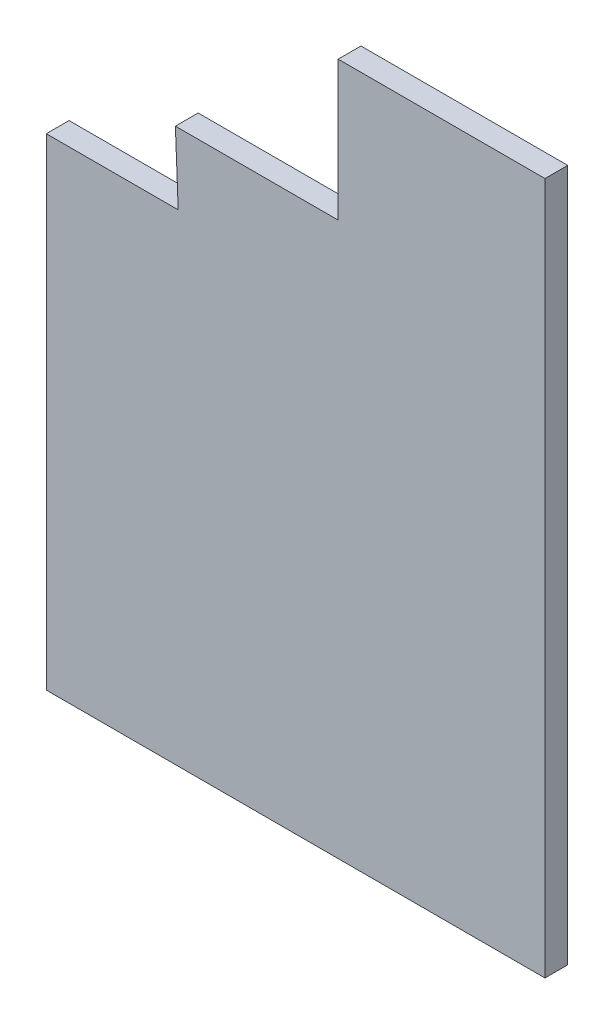
ISO-10303-21;
HEADER;
FILE_DESCRIPTION(('STEP AP214'),'2;1');
FILE_NAME('part.step','',(''),(''),'','','');
FILE_SCHEMA(('AUTOMOTIVE_DESIGN { 1 0 10303 214 1 1 1 1 }'));
ENDSEC;
DATA;
#1=APPLICATION_CONTEXT('core data for automotive mechanical design processes');
#2=APPLICATION_PROTOCOL_DEFINITION('international standard','automotive_design',2000,#1);
#3=PRODUCT_CONTEXT('',#1,'mechanical');
#4=PRODUCT('Part','Part','',(#3));
#5=PRODUCT_RELATED_PRODUCT_CATEGORY('part','',(#4));
#6=PRODUCT_DEFINITION_FORMATION('','',#4);
#7=PRODUCT_DEFINITION_CONTEXT('part definition',#1,'design');
#8=PRODUCT_DEFINITION('design','',#6,#7);
#9=PRODUCT_DEFINITION_SHAPE('','',#8);
#10=(LENGTH_UNIT() NAMED_UNIT(*) SI_UNIT(.MILLI.,.METRE.));
#11=(NAMED_UNIT(*) PLANE_ANGLE_UNIT() SI_UNIT($,.RADIAN.));
#12=(NAMED_UNIT(*) SI_UNIT($,.STERADIAN.) SOLID_ANGLE_UNIT());
#13=UNCERTAINTY_MEASURE_WITH_UNIT(LENGTH_MEASURE(1.E-05),#10,'distance_accuracy_value','');
#14=(GEOMETRIC_REPRESENTATION_CONTEXT(3) GLOBAL_UNCERTAINTY_ASSIGNED_CONTEXT((#13)) GLOBAL_UNIT_ASSIGNED_CONTEXT((#10,
#11,#12)) REPRESENTATION_CONTEXT('',''));
#15=CARTESIAN_POINT('',(0.,0.,0.));
#16=DIRECTION('',(0.,0.,1.));
#17=DIRECTION('',(1.,0.,0.));
#18=AXIS2_PLACEMENT_3D('',#15,#16,#17);
#19=CARTESIAN_POINT('',(11.712255719514,13.395011994689,0.5));
#20=DIRECTION('',(0.,0.,1.));
#21=DIRECTION('',(1.,0.,0.));
#22=AXIS2_PLACEMENT_3D('',#19,#20,#21);
#23=PLANE('',#22);
#24=DIRECTION('',(0.,1.,0.));
#25=VECTOR('',#24,1.);
#26=CARTESIAN_POINT('',(12.190204,18.392698,0.5));
#27=LINE('',#26,#25);
#28=CARTESIAN_POINT('',(12.190204,18.392698,0.5));
#29=VERTEX_POINT('',#28);
#30=CARTESIAN_POINT('',(12.190204,21.454895,0.5));
#31=VERTEX_POINT('',#30);
#32=EDGE_CURVE('E25',#29,#31,#27,.T.);
#33=ORIENTED_EDGE('',*,*,#32,.F.);
#34=DIRECTION('',(1.,0.,0.));
#35=VECTOR('',#34,1.);
#36=CARTESIAN_POINT('',(8.614215,18.392698,0.5));
#37=LINE('',#36,#35);
#38=CARTESIAN_POINT('',(8.614215,18.392698,0.5));
#39=VERTEX_POINT('',#38);
#40=EDGE_CURVE('E149',#39,#29,#37,.T.);
#41=ORIENTED_EDGE('',*,*,#40,.F.);
#42=DIRECTION('',(-0.0394430339495683,0.999221820754958,0.));
#43=VECTOR('',#42,1.);
#44=CARTESIAN_POINT('',(8.67587,16.830774,0.5));
#45=LINE('',#44,#43);
#46=CARTESIAN_POINT('',(8.67587,16.830774,0.5));
#47=VERTEX_POINT('',#46);
#48=EDGE_CURVE('E112',#47,#39,#45,.T.);
#49=ORIENTED_EDGE('',*,*,#48,.F.);
#50=DIRECTION('',(1.,0.,0.));
#51=VECTOR('',#50,1.);
#52=CARTESIAN_POINT('',(5.778087,16.830774,0.5));
#53=LINE('',#52,#51);
#54=CARTESIAN_POINT('',(5.778087,16.830774,0.5));
#55=VERTEX_POINT('',#54);
#56=EDGE_CURVE('E123',#55,#47,#53,.T.);
#57=ORIENTED_EDGE('',*,*,#56,.F.);
#58=DIRECTION('',(0.,1.,0.));
#59=VECTOR('',#58,1.);
#60=CARTESIAN_POINT('',(5.778087,6.246672,0.5));
#61=LINE('',#60,#59);
#62=CARTESIAN_POINT('',(5.778087,6.246672,0.5));
#63=VERTEX_POINT('',#62);
#64=EDGE_CURVE('E130',#63,#55,#61,.T.);
#65=ORIENTED_EDGE('',*,*,#64,.F.);
#66=DIRECTION('',(-1.,0.,0.));
#67=VECTOR('',#66,1.);
#68=CARTESIAN_POINT('',(16.732119,6.246672,0.5));
#69=LINE('',#68,#67);
#70=CARTESIAN_POINT('',(16.732119,6.246672,0.5));
#71=VERTEX_POINT('',#70);
#72=EDGE_CURVE('E194',#71,#63,#69,.T.);
#73=ORIENTED_EDGE('',*,*,#72,.F.);
#74=DIRECTION('',(0.,-1.,0.));
#75=VECTOR('',#74,1.);
#76=CARTESIAN_POINT('',(16.732119,21.454895,0.5));
#77=LINE('',#76,#75);
#78=CARTESIAN_POINT('',(16.732119,21.454895,0.5));
#79=VERTEX_POINT('',#78);
#80=EDGE_CURVE('E170',#79,#71,#77,.T.);
#81=ORIENTED_EDGE('',*,*,#80,.F.);
#82=DIRECTION('',(1.,0.,0.));
#83=VECTOR('',#82,1.);
#84=CARTESIAN_POINT('',(12.190204,21.454895,0.5));
#85=LINE('',#84,#83);
#86=EDGE_CURVE('E164',#31,#79,#85,.T.);
#87=ORIENTED_EDGE('',*,*,#86,.F.);
#88=EDGE_LOOP('',(#33,#41,#49,#57,#65,#73,#81,#87));
#89=FACE_BOUND('',#88,.T.);
#90=ADVANCED_FACE('F17',(#89),#23,.T.);
#91=CARTESIAN_POINT('',(11.712255719514,13.395011994689,0.));
#92=DIRECTION('',(0.,0.,1.));
#93=DIRECTION('',(1.,0.,0.));
#94=AXIS2_PLACEMENT_3D('',#91,#92,#93);
#95=PLANE('',#94);
#96=DIRECTION('',(1.,0.,0.));
#97=VECTOR('',#96,1.);
#98=CARTESIAN_POINT('',(12.190204,21.454895,0.));
#99=LINE('',#98,#97);
#100=CARTESIAN_POINT('',(12.190204,21.454895,0.));
#101=VERTEX_POINT('',#100);
#102=CARTESIAN_POINT('',(16.732119,21.454895,0.));
#103=VERTEX_POINT('',#102);
#104=EDGE_CURVE('E176',#101,#103,#99,.T.);
#105=ORIENTED_EDGE('',*,*,#104,.T.);
#106=DIRECTION('',(0.,-1.,0.));
#107=VECTOR('',#106,1.);
#108=CARTESIAN_POINT('',(16.732119,21.454895,0.));
#109=LINE('',#108,#107);
#110=CARTESIAN_POINT('',(16.732119,6.246672,0.));
#111=VERTEX_POINT('',#110);
#112=EDGE_CURVE('E195',#103,#111,#109,.T.);
#113=ORIENTED_EDGE('',*,*,#112,.T.);
#114=DIRECTION('',(-1.,0.,0.));
#115=VECTOR('',#114,1.);
#116=CARTESIAN_POINT('',(16.732119,6.246672,0.));
#117=LINE('',#116,#115);
#118=CARTESIAN_POINT('',(5.778087,6.246672,0.));
#119=VERTEX_POINT('',#118);
#120=EDGE_CURVE('E119',#111,#119,#117,.T.);
#121=ORIENTED_EDGE('',*,*,#120,.T.);
#122=DIRECTION('',(0.,1.,0.));
#123=VECTOR('',#122,1.);
#124=CARTESIAN_POINT('',(5.778087,6.246672,0.));
#125=LINE('',#124,#123);
#126=CARTESIAN_POINT('',(5.778087,16.830774,0.));
#127=VERTEX_POINT('',#126);
#128=EDGE_CURVE('E111',#119,#127,#125,.T.);
#129=ORIENTED_EDGE('',*,*,#128,.T.);
#130=DIRECTION('',(1.,0.,0.));
#131=VECTOR('',#130,1.);
#132=CARTESIAN_POINT('',(5.778087,16.830774,0.));
#133=LINE('',#132,#131);
#134=CARTESIAN_POINT('',(8.67587,16.830774,0.));
#135=VERTEX_POINT('',#134);
#136=EDGE_CURVE('E97',#127,#135,#133,.T.);
#137=ORIENTED_EDGE('',*,*,#136,.T.);
#138=DIRECTION('',(-0.0394430339495683,0.999221820754958,0.));
#139=VECTOR('',#138,1.);
#140=CARTESIAN_POINT('',(8.67587,16.830774,0.));
#141=LINE('',#140,#139);
#142=CARTESIAN_POINT('',(8.614215,18.392698,0.));
#143=VERTEX_POINT('',#142);
#144=EDGE_CURVE('E148',#135,#143,#141,.T.);
#145=ORIENTED_EDGE('',*,*,#144,.T.);
#146=DIRECTION('',(1.,0.,0.));
#147=VECTOR('',#146,1.);
#148=CARTESIAN_POINT('',(8.614215,18.392698,0.));
#149=LINE('',#148,#147);
#150=CARTESIAN_POINT('',(12.190204,18.392698,0.));
#151=VERTEX_POINT('',#150);
#152=EDGE_CURVE('E156',#143,#151,#149,.T.);
#153=ORIENTED_EDGE('',*,*,#152,.T.);
#154=DIRECTION('',(0.,1.,0.));
#155=VECTOR('',#154,1.);
#156=CARTESIAN_POINT('',(12.190204,18.392698,0.));
#157=LINE('',#156,#155);
#158=EDGE_CURVE('E11',#151,#101,#157,.T.);
#159=ORIENTED_EDGE('',*,*,#158,.T.);
#160=EDGE_LOOP('',(#105,#113,#121,#129,#137,#145,#153,#159));
#161=FACE_BOUND('',#160,.T.);
#162=ADVANCED_FACE('F116',(#161),#95,.F.);
#163=CARTESIAN_POINT('',(12.190204,18.392698,0.));
#164=DIRECTION('',(-1.,0.,0.));
#165=DIRECTION('',(0.,0.,1.));
#166=AXIS2_PLACEMENT_3D('',#163,#164,#165);
#167=PLANE('',#166);
#168=DIRECTION('',(0.,0.,1.));
#169=VECTOR('',#168,1.);
#170=CARTESIAN_POINT('',(12.190204,18.392698,0.));
#171=LINE('',#170,#169);
#172=EDGE_CURVE('E153',#151,#29,#171,.T.);
#173=ORIENTED_EDGE('',*,*,#172,.T.);
#174=ORIENTED_EDGE('',*,*,#32,.T.);
#175=DIRECTION('',(0.,0.,1.));
#176=VECTOR('',#175,1.);
#177=CARTESIAN_POINT('',(12.190204,21.454895,0.));
#178=LINE('',#177,#176);
#179=EDGE_CURVE('E165',#101,#31,#178,.T.);
#180=ORIENTED_EDGE('',*,*,#179,.F.);
#181=ORIENTED_EDGE('',*,*,#158,.F.);
#182=EDGE_LOOP('',(#173,#174,#180,#181));
#183=FACE_BOUND('',#182,.T.);
#184=ADVANCED_FACE('F159',(#183),#167,.T.);
#185=CARTESIAN_POINT('',(8.614215,18.392698,0.));
#186=DIRECTION('',(0.,1.,0.));
#187=DIRECTION('',(1.,0.,0.));
#188=AXIS2_PLACEMENT_3D('',#185,#186,#187);
#189=PLANE('',#188);
#190=DIRECTION('',(0.,0.,1.));
#191=VECTOR('',#190,1.);
#192=CARTESIAN_POINT('',(8.614215,18.392698,0.));
#193=LINE('',#192,#191);
#194=EDGE_CURVE('E142',#143,#39,#193,.T.);
#195=ORIENTED_EDGE('',*,*,#194,.T.);
#196=ORIENTED_EDGE('',*,*,#40,.T.);
#197=ORIENTED_EDGE('',*,*,#172,.F.);
#198=ORIENTED_EDGE('',*,*,#152,.F.);
#199=EDGE_LOOP('',(#195,#196,#197,#198));
#200=FACE_BOUND('',#199,.T.);
#201=ADVANCED_FACE('F227',(#200),#189,.T.);
#202=CARTESIAN_POINT('',(8.67587,16.830774,0.));
#203=DIRECTION('',(-0.999221820754958,-0.0394430339495683,0.));
#204=DIRECTION('',(-0.0394430339495683,0.999221820754958,0.));
#205=AXIS2_PLACEMENT_3D('',#202,#203,#204);
#206=PLANE('',#205);
#207=DIRECTION('',(0.,0.,1.));
#208=VECTOR('',#207,1.);
#209=CARTESIAN_POINT('',(8.67587,16.830774,0.));
#210=LINE('',#209,#208);
#211=EDGE_CURVE('E110',#135,#47,#210,.T.);
#212=ORIENTED_EDGE('',*,*,#211,.T.);
#213=ORIENTED_EDGE('',*,*,#48,.T.);
#214=ORIENTED_EDGE('',*,*,#194,.F.);
#215=ORIENTED_EDGE('',*,*,#144,.F.);
#216=EDGE_LOOP('',(#212,#213,#214,#215));
#217=FACE_BOUND('',#216,.T.);
#218=ADVANCED_FACE('F231',(#217),#206,.T.);
#219=CARTESIAN_POINT('',(5.778087,16.830774,0.));
#220=DIRECTION('',(0.,1.,0.));
#221=DIRECTION('',(1.,0.,0.));
#222=AXIS2_PLACEMENT_3D('',#219,#220,#221);
#223=PLANE('',#222);
#224=DIRECTION('',(0.,0.,1.));
#225=VECTOR('',#224,1.);
#226=CARTESIAN_POINT('',(5.778087,16.830774,0.));
#227=LINE('',#226,#225);
#228=EDGE_CURVE('E102',#127,#55,#227,.T.);
#229=ORIENTED_EDGE('',*,*,#228,.T.);
#230=ORIENTED_EDGE('',*,*,#56,.T.);
#231=ORIENTED_EDGE('',*,*,#211,.F.);
#232=ORIENTED_EDGE('',*,*,#136,.F.);
#233=EDGE_LOOP('',(#229,#230,#231,#232));
#234=FACE_BOUND('',#233,.T.);
#235=ADVANCED_FACE('F101',(#234),#223,.T.);
#236=CARTESIAN_POINT('',(5.778087,6.246672,0.));
#237=DIRECTION('',(-1.,0.,0.));
#238=DIRECTION('',(0.,0.,1.));
#239=AXIS2_PLACEMENT_3D('',#236,#237,#238);
#240=PLANE('',#239);
#241=DIRECTION('',(0.,0.,1.));
#242=VECTOR('',#241,1.);
#243=CARTESIAN_POINT('',(5.778087,6.246672,0.));
#244=LINE('',#243,#242);
#245=EDGE_CURVE('E133',#119,#63,#244,.T.);
#246=ORIENTED_EDGE('',*,*,#245,.T.);
#247=ORIENTED_EDGE('',*,*,#64,.T.);
#248=ORIENTED_EDGE('',*,*,#228,.F.);
#249=ORIENTED_EDGE('',*,*,#128,.F.);
#250=EDGE_LOOP('',(#246,#247,#248,#249));
#251=FACE_BOUND('',#250,.T.);
#252=ADVANCED_FACE('F124',(#251),#240,.T.);
#253=CARTESIAN_POINT('',(16.732119,6.246672,0.));
#254=DIRECTION('',(0.,-1.,0.));
#255=DIRECTION('',(0.,0.,-1.));
#256=AXIS2_PLACEMENT_3D('',#253,#254,#255);
#257=PLANE('',#256);
#258=DIRECTION('',(0.,0.,1.));
#259=VECTOR('',#258,1.);
#260=CARTESIAN_POINT('',(16.732119,6.246672,0.));
#261=LINE('',#260,#259);
#262=EDGE_CURVE('E191',#111,#71,#261,.T.);
#263=ORIENTED_EDGE('',*,*,#262,.T.);
#264=ORIENTED_EDGE('',*,*,#72,.T.);
#265=ORIENTED_EDGE('',*,*,#245,.F.);
#266=ORIENTED_EDGE('',*,*,#120,.F.);
#267=EDGE_LOOP('',(#263,#264,#265,#266));
#268=FACE_BOUND('',#267,.T.);
#269=ADVANCED_FACE('F201',(#268),#257,.T.);
#270=CARTESIAN_POINT('',(16.732119,21.454895,0.));
#271=DIRECTION('',(1.,0.,0.));
#272=DIRECTION('',(0.,1.,0.));
#273=AXIS2_PLACEMENT_3D('',#270,#271,#272);
#274=PLANE('',#273);
#275=DIRECTION('',(0.,0.,1.));
#276=VECTOR('',#275,1.);
#277=CARTESIAN_POINT('',(16.732119,21.454895,0.));
#278=LINE('',#277,#276);
#279=EDGE_CURVE('E172',#103,#79,#278,.T.);
#280=ORIENTED_EDGE('',*,*,#279,.T.);
#281=ORIENTED_EDGE('',*,*,#80,.T.);
#282=ORIENTED_EDGE('',*,*,#262,.F.);
#283=ORIENTED_EDGE('',*,*,#112,.F.);
#284=EDGE_LOOP('',(#280,#281,#282,#283));
#285=FACE_BOUND('',#284,.T.);
#286=ADVANCED_FACE('F206',(#285),#274,.T.);
#287=CARTESIAN_POINT('',(12.190204,21.454895,0.));
#288=DIRECTION('',(0.,1.,0.));
#289=DIRECTION('',(1.,0.,0.));
#290=AXIS2_PLACEMENT_3D('',#287,#288,#289);
#291=PLANE('',#290);
#292=ORIENTED_EDGE('',*,*,#179,.T.);
#293=ORIENTED_EDGE('',*,*,#86,.T.);
#294=ORIENTED_EDGE('',*,*,#279,.F.);
#295=ORIENTED_EDGE('',*,*,#104,.F.);
#296=EDGE_LOOP('',(#292,#293,#294,#295));
#297=FACE_BOUND('',#296,.T.);
#298=ADVANCED_FACE('F175',(#297),#291,.T.);
#299=CLOSED_SHELL('',(#90,#162,#184,#201,#218,#235,#252,#269,#286,#298));
#300=MANIFOLD_SOLID_BREP('B1',#299);
#301=ADVANCED_BREP_SHAPE_REPRESENTATION('',(#18,#300),#14);
#302=SHAPE_DEFINITION_REPRESENTATION(#9,#301);
ENDSEC;
END-ISO-10303-21;
